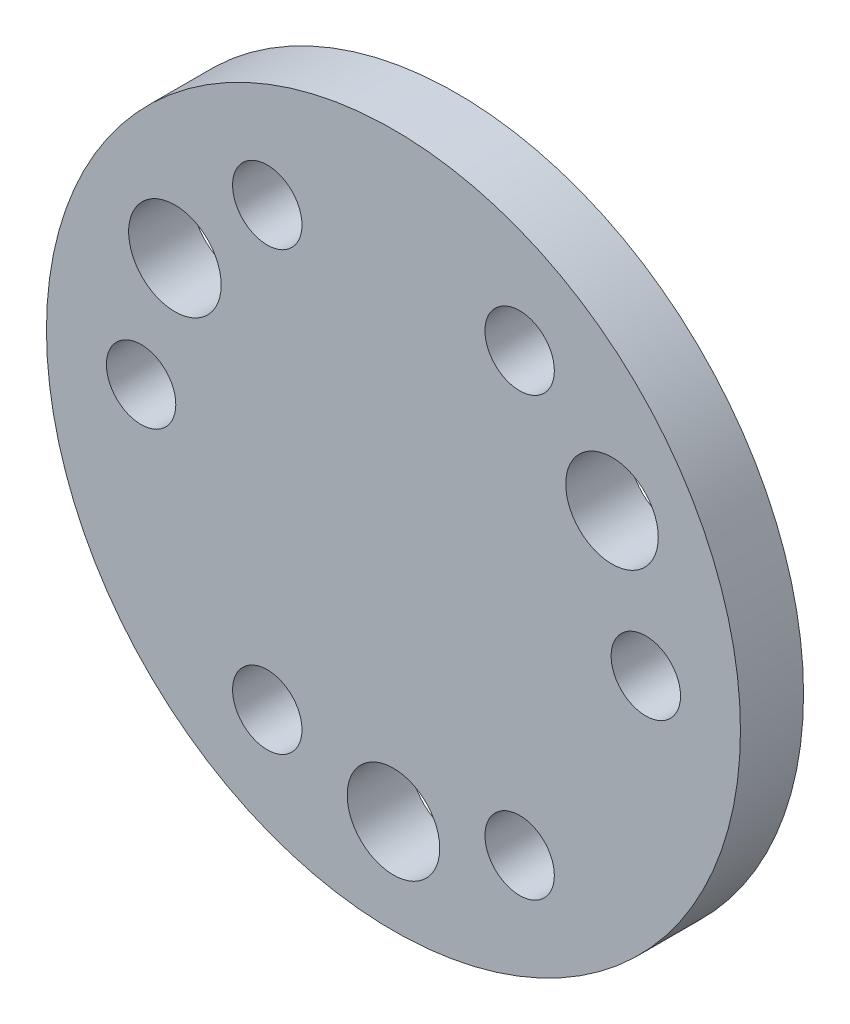
ISO-10303-21;
HEADER;
FILE_DESCRIPTION(('STEP AP214'),'2;1');
FILE_NAME('part.step','',(''),(''),'','','');
FILE_SCHEMA(('AUTOMOTIVE_DESIGN { 1 0 10303 214 1 1 1 1 }'));
ENDSEC;
DATA;
#1=APPLICATION_CONTEXT('core data for automotive mechanical design processes');
#2=APPLICATION_PROTOCOL_DEFINITION('international standard','automotive_design',2000,#1);
#3=PRODUCT_CONTEXT('',#1,'mechanical');
#4=PRODUCT('Part','Part','',(#3));
#5=PRODUCT_RELATED_PRODUCT_CATEGORY('part','',(#4));
#6=PRODUCT_DEFINITION_FORMATION('','',#4);
#7=PRODUCT_DEFINITION_CONTEXT('part definition',#1,'design');
#8=PRODUCT_DEFINITION('design','',#6,#7);
#9=PRODUCT_DEFINITION_SHAPE('','',#8);
#10=(LENGTH_UNIT() NAMED_UNIT(*) SI_UNIT(.MILLI.,.METRE.));
#11=(NAMED_UNIT(*) PLANE_ANGLE_UNIT() SI_UNIT($,.RADIAN.));
#12=(NAMED_UNIT(*) SI_UNIT($,.STERADIAN.) SOLID_ANGLE_UNIT());
#13=UNCERTAINTY_MEASURE_WITH_UNIT(LENGTH_MEASURE(1.E-05),#10,'distance_accuracy_value','');
#14=(GEOMETRIC_REPRESENTATION_CONTEXT(3) GLOBAL_UNCERTAINTY_ASSIGNED_CONTEXT((#13)) GLOBAL_UNIT_ASSIGNED_CONTEXT((#10,
#11,#12)) REPRESENTATION_CONTEXT('',''));
#15=CARTESIAN_POINT('',(0.,0.,0.));
#16=DIRECTION('',(0.,0.,1.));
#17=DIRECTION('',(1.,0.,0.));
#18=AXIS2_PLACEMENT_3D('',#15,#16,#17);
#19=CARTESIAN_POINT('',(0.,0.,3.));
#20=DIRECTION('',(0.,0.,1.));
#21=DIRECTION('',(1.,0.,0.));
#22=AXIS2_PLACEMENT_3D('',#19,#20,#21);
#23=PLANE('',#22);
#24=CARTESIAN_POINT('',(-5.99999999999703,-10.3923048454114,3.));
#25=DIRECTION('',(0.,0.,1.));
#26=DIRECTION('',(1.,0.,0.));
#27=AXIS2_PLACEMENT_3D('',#24,#25,#26);
#28=CIRCLE('',#27,1.64999999999803);
#29=CARTESIAN_POINT('',(-4.34999999999899,-10.3923048454114,3.));
#30=VERTEX_POINT('',#29);
#31=EDGE_CURVE('E113',#30,#30,#28,.T.);
#32=ORIENTED_EDGE('',*,*,#31,.F.);
#33=EDGE_LOOP('',(#32));
#34=FACE_BOUND('',#33,.T.);
#35=CARTESIAN_POINT('',(5.99999999999987,10.3923048454135,3.));
#36=DIRECTION('',(0.,0.,1.));
#37=DIRECTION('',(1.,0.,0.));
#38=AXIS2_PLACEMENT_3D('',#35,#36,#37);
#39=CIRCLE('',#38,1.64999999999995);
#40=CARTESIAN_POINT('',(7.64999999999982,10.3923048454135,3.));
#41=VERTEX_POINT('',#40);
#42=EDGE_CURVE('E97',#41,#41,#39,.T.);
#43=ORIENTED_EDGE('',*,*,#42,.F.);
#44=EDGE_LOOP('',(#43));
#45=FACE_BOUND('',#44,.T.);
#46=CARTESIAN_POINT('',(10.3923048454115,5.99999999999744,3.));
#47=DIRECTION('',(0.,0.,1.));
#48=DIRECTION('',(1.,0.,0.));
#49=AXIS2_PLACEMENT_3D('',#46,#47,#48);
#50=CIRCLE('',#49,2.20000000000026);
#51=CARTESIAN_POINT('',(12.5923048454118,5.99999999999744,3.));
#52=VERTEX_POINT('',#51);
#53=EDGE_CURVE('E81',#52,#52,#50,.T.);
#54=ORIENTED_EDGE('',*,*,#53,.F.);
#55=EDGE_LOOP('',(#54));
#56=FACE_BOUND('',#55,.T.);
#57=CARTESIAN_POINT('',(-6.00000000000001,10.39230484541,3.));
#58=DIRECTION('',(0.,0.,1.));
#59=DIRECTION('',(1.,0.,0.));
#60=AXIS2_PLACEMENT_3D('',#57,#58,#59);
#61=CIRCLE('',#60,1.64999999999799);
#62=CARTESIAN_POINT('',(-4.35000000000203,10.39230484541,3.));
#63=VERTEX_POINT('',#62);
#64=EDGE_CURVE('E65',#63,#63,#61,.T.);
#65=ORIENTED_EDGE('',*,*,#64,.F.);
#66=EDGE_LOOP('',(#65));
#67=FACE_BOUND('',#66,.T.);
#68=CARTESIAN_POINT('',(0.,0.,3.));
#69=DIRECTION('',(0.,0.,1.));
#70=DIRECTION('',(1.,0.,0.));
#71=AXIS2_PLACEMENT_3D('',#68,#69,#70);
#72=CIRCLE('',#71,16.5);
#73=CARTESIAN_POINT('',(16.5,0.,3.));
#74=VERTEX_POINT('',#73);
#75=EDGE_CURVE('E10',#74,#74,#72,.T.);
#76=ORIENTED_EDGE('',*,*,#75,.T.);
#77=EDGE_LOOP('',(#76));
#78=FACE_BOUND('',#77,.T.);
#79=CARTESIAN_POINT('',(-10.39230484541,6.00000000000001,3.));
#80=DIRECTION('',(0.,0.,1.));
#81=DIRECTION('',(1.,0.,0.));
#82=AXIS2_PLACEMENT_3D('',#79,#80,#81);
#83=CIRCLE('',#82,2.2);
#84=CARTESIAN_POINT('',(-8.19230484541001,6.00000000000001,3.));
#85=VERTEX_POINT('',#84);
#86=EDGE_CURVE('E59',#85,#85,#83,.T.);
#87=ORIENTED_EDGE('',*,*,#86,.F.);
#88=EDGE_LOOP('',(#87));
#89=FACE_BOUND('',#88,.T.);
#90=CARTESIAN_POINT('',(-12.,0.,3.));
#91=DIRECTION('',(0.,0.,1.));
#92=DIRECTION('',(1.,0.,0.));
#93=AXIS2_PLACEMENT_3D('',#90,#91,#92);
#94=CIRCLE('',#93,1.64999999999972);
#95=CARTESIAN_POINT('',(-10.3500000000003,0.,3.));
#96=VERTEX_POINT('',#95);
#97=EDGE_CURVE('E73',#96,#96,#94,.T.);
#98=ORIENTED_EDGE('',*,*,#97,.F.);
#99=EDGE_LOOP('',(#98));
#100=FACE_BOUND('',#99,.T.);
#101=CARTESIAN_POINT('',(11.999999999997,1.89623865412681E-12,3.));
#102=DIRECTION('',(0.,0.,1.));
#103=DIRECTION('',(1.,0.,0.));
#104=AXIS2_PLACEMENT_3D('',#101,#102,#103);
#105=CIRCLE('',#104,1.64999999999826);
#106=CARTESIAN_POINT('',(13.6499999999953,1.89623865412681E-12,3.));
#107=VERTEX_POINT('',#106);
#108=EDGE_CURVE('E89',#107,#107,#105,.T.);
#109=ORIENTED_EDGE('',*,*,#108,.F.);
#110=EDGE_LOOP('',(#109));
#111=FACE_BOUND('',#110,.T.);
#112=CARTESIAN_POINT('',(-1.48358097951961E-12,-11.9999999999969,3.));
#113=DIRECTION('',(0.,0.,1.));
#114=DIRECTION('',(1.,0.,0.));
#115=AXIS2_PLACEMENT_3D('',#112,#113,#114);
#116=CIRCLE('',#115,2.20000000000002);
#117=CARTESIAN_POINT('',(2.19999999999853,-11.9999999999969,3.));
#118=VERTEX_POINT('',#117);
#119=EDGE_CURVE('E105',#118,#118,#116,.T.);
#120=ORIENTED_EDGE('',*,*,#119,.F.);
#121=EDGE_LOOP('',(#120));
#122=FACE_BOUND('',#121,.T.);
#123=CARTESIAN_POINT('',(6.00000000000015,-10.392304845413,3.));
#124=DIRECTION('',(0.,0.,1.));
#125=DIRECTION('',(1.,0.,0.));
#126=AXIS2_PLACEMENT_3D('',#123,#124,#125);
#127=CIRCLE('',#126,1.64999999999969);
#128=CARTESIAN_POINT('',(7.64999999999983,-10.392304845413,3.));
#129=VERTEX_POINT('',#128);
#130=EDGE_CURVE('E121',#129,#129,#127,.T.);
#131=ORIENTED_EDGE('',*,*,#130,.F.);
#132=EDGE_LOOP('',(#131));
#133=FACE_BOUND('',#132,.T.);
#134=ADVANCED_FACE('F45',(#34,#45,#56,#67,#78,#89,#100,#111,#122,#133),#23,.T.);
#135=CARTESIAN_POINT('',(0.,0.,0.));
#136=DIRECTION('',(0.,0.,1.));
#137=DIRECTION('',(1.,0.,0.));
#138=AXIS2_PLACEMENT_3D('',#135,#136,#137);
#139=PLANE('',#138);
#140=CARTESIAN_POINT('',(0.,0.,0.));
#141=DIRECTION('',(0.,0.,1.));
#142=DIRECTION('',(1.,0.,0.));
#143=AXIS2_PLACEMENT_3D('',#140,#141,#142);
#144=CIRCLE('',#143,16.5);
#145=CARTESIAN_POINT('',(16.5,0.,0.));
#146=VERTEX_POINT('',#145);
#147=EDGE_CURVE('E49',#146,#146,#144,.T.);
#148=ORIENTED_EDGE('',*,*,#147,.F.);
#149=EDGE_LOOP('',(#148));
#150=FACE_BOUND('',#149,.T.);
#151=CARTESIAN_POINT('',(-10.39230484541,6.00000000000001,0.));
#152=DIRECTION('',(0.,0.,1.));
#153=DIRECTION('',(1.,0.,0.));
#154=AXIS2_PLACEMENT_3D('',#151,#152,#153);
#155=CIRCLE('',#154,2.2);
#156=CARTESIAN_POINT('',(-8.19230484541001,6.00000000000001,0.));
#157=VERTEX_POINT('',#156);
#158=EDGE_CURVE('E61',#157,#157,#155,.T.);
#159=ORIENTED_EDGE('',*,*,#158,.T.);
#160=EDGE_LOOP('',(#159));
#161=FACE_BOUND('',#160,.T.);
#162=CARTESIAN_POINT('',(-6.00000000000001,10.39230484541,0.));
#163=DIRECTION('',(0.,0.,1.));
#164=DIRECTION('',(1.,0.,0.));
#165=AXIS2_PLACEMENT_3D('',#162,#163,#164);
#166=CIRCLE('',#165,1.64999999999799);
#167=CARTESIAN_POINT('',(-4.35000000000203,10.39230484541,0.));
#168=VERTEX_POINT('',#167);
#169=EDGE_CURVE('E69',#168,#168,#166,.T.);
#170=ORIENTED_EDGE('',*,*,#169,.T.);
#171=EDGE_LOOP('',(#170));
#172=FACE_BOUND('',#171,.T.);
#173=CARTESIAN_POINT('',(-12.,0.,0.));
#174=DIRECTION('',(0.,0.,1.));
#175=DIRECTION('',(1.,0.,0.));
#176=AXIS2_PLACEMENT_3D('',#173,#174,#175);
#177=CIRCLE('',#176,1.64999999999972);
#178=CARTESIAN_POINT('',(-10.3500000000003,0.,0.));
#179=VERTEX_POINT('',#178);
#180=EDGE_CURVE('E77',#179,#179,#177,.T.);
#181=ORIENTED_EDGE('',*,*,#180,.T.);
#182=EDGE_LOOP('',(#181));
#183=FACE_BOUND('',#182,.T.);
#184=CARTESIAN_POINT('',(10.3923048454115,5.99999999999744,0.));
#185=DIRECTION('',(0.,0.,1.));
#186=DIRECTION('',(1.,0.,0.));
#187=AXIS2_PLACEMENT_3D('',#184,#185,#186);
#188=CIRCLE('',#187,2.20000000000026);
#189=CARTESIAN_POINT('',(12.5923048454118,5.99999999999744,0.));
#190=VERTEX_POINT('',#189);
#191=EDGE_CURVE('E85',#190,#190,#188,.T.);
#192=ORIENTED_EDGE('',*,*,#191,.T.);
#193=EDGE_LOOP('',(#192));
#194=FACE_BOUND('',#193,.T.);
#195=CARTESIAN_POINT('',(11.999999999997,1.89623865412681E-12,0.));
#196=DIRECTION('',(0.,0.,1.));
#197=DIRECTION('',(1.,0.,0.));
#198=AXIS2_PLACEMENT_3D('',#195,#196,#197);
#199=CIRCLE('',#198,1.64999999999826);
#200=CARTESIAN_POINT('',(13.6499999999953,1.89623865412681E-12,0.));
#201=VERTEX_POINT('',#200);
#202=EDGE_CURVE('E93',#201,#201,#199,.T.);
#203=ORIENTED_EDGE('',*,*,#202,.T.);
#204=EDGE_LOOP('',(#203));
#205=FACE_BOUND('',#204,.T.);
#206=CARTESIAN_POINT('',(5.99999999999987,10.3923048454135,0.));
#207=DIRECTION('',(0.,0.,1.));
#208=DIRECTION('',(1.,0.,0.));
#209=AXIS2_PLACEMENT_3D('',#206,#207,#208);
#210=CIRCLE('',#209,1.64999999999995);
#211=CARTESIAN_POINT('',(7.64999999999982,10.3923048454135,0.));
#212=VERTEX_POINT('',#211);
#213=EDGE_CURVE('E101',#212,#212,#210,.T.);
#214=ORIENTED_EDGE('',*,*,#213,.T.);
#215=EDGE_LOOP('',(#214));
#216=FACE_BOUND('',#215,.T.);
#217=CARTESIAN_POINT('',(-1.48358097951961E-12,-11.9999999999969,0.));
#218=DIRECTION('',(0.,0.,1.));
#219=DIRECTION('',(1.,0.,0.));
#220=AXIS2_PLACEMENT_3D('',#217,#218,#219);
#221=CIRCLE('',#220,2.20000000000002);
#222=CARTESIAN_POINT('',(2.19999999999853,-11.9999999999969,0.));
#223=VERTEX_POINT('',#222);
#224=EDGE_CURVE('E109',#223,#223,#221,.T.);
#225=ORIENTED_EDGE('',*,*,#224,.T.);
#226=EDGE_LOOP('',(#225));
#227=FACE_BOUND('',#226,.T.);
#228=CARTESIAN_POINT('',(-5.99999999999703,-10.3923048454114,0.));
#229=DIRECTION('',(0.,0.,1.));
#230=DIRECTION('',(1.,0.,0.));
#231=AXIS2_PLACEMENT_3D('',#228,#229,#230);
#232=CIRCLE('',#231,1.64999999999803);
#233=CARTESIAN_POINT('',(-4.34999999999899,-10.3923048454114,0.));
#234=VERTEX_POINT('',#233);
#235=EDGE_CURVE('E117',#234,#234,#232,.T.);
#236=ORIENTED_EDGE('',*,*,#235,.T.);
#237=EDGE_LOOP('',(#236));
#238=FACE_BOUND('',#237,.T.);
#239=CARTESIAN_POINT('',(6.00000000000015,-10.392304845413,0.));
#240=DIRECTION('',(0.,0.,1.));
#241=DIRECTION('',(1.,0.,0.));
#242=AXIS2_PLACEMENT_3D('',#239,#240,#241);
#243=CIRCLE('',#242,1.64999999999969);
#244=CARTESIAN_POINT('',(7.64999999999983,-10.392304845413,0.));
#245=VERTEX_POINT('',#244);
#246=EDGE_CURVE('E125',#245,#245,#243,.T.);
#247=ORIENTED_EDGE('',*,*,#246,.T.);
#248=EDGE_LOOP('',(#247));
#249=FACE_BOUND('',#248,.T.);
#250=ADVANCED_FACE('F138',(#150,#161,#172,#183,#194,#205,#216,#227,#238,#249),#139,.F.);
#251=CARTESIAN_POINT('',(0.,0.,3.));
#252=DIRECTION('',(0.,0.,-1.));
#253=DIRECTION('',(-1.,0.,0.));
#254=AXIS2_PLACEMENT_3D('',#251,#252,#253);
#255=CYLINDRICAL_SURFACE('',#254,16.5);
#256=ORIENTED_EDGE('',*,*,#75,.F.);
#257=EDGE_LOOP('',(#256));
#258=FACE_BOUND('',#257,.T.);
#259=ORIENTED_EDGE('',*,*,#147,.T.);
#260=EDGE_LOOP('',(#259));
#261=FACE_BOUND('',#260,.T.);
#262=ADVANCED_FACE('F47',(#258,#261),#255,.T.);
#263=CARTESIAN_POINT('',(-10.39230484541,6.00000000000001,3.));
#264=DIRECTION('',(0.,0.,-1.));
#265=DIRECTION('',(-1.,0.,0.));
#266=AXIS2_PLACEMENT_3D('',#263,#264,#265);
#267=CYLINDRICAL_SURFACE('',#266,2.2);
#268=ORIENTED_EDGE('',*,*,#86,.T.);
#269=EDGE_LOOP('',(#268));
#270=FACE_BOUND('',#269,.T.);
#271=ORIENTED_EDGE('',*,*,#158,.F.);
#272=EDGE_LOOP('',(#271));
#273=FACE_BOUND('',#272,.T.);
#274=ADVANCED_FACE('F148',(#270,#273),#267,.F.);
#275=CARTESIAN_POINT('',(-6.00000000000001,10.39230484541,3.));
#276=DIRECTION('',(0.,0.,-1.));
#277=DIRECTION('',(-1.,0.,0.));
#278=AXIS2_PLACEMENT_3D('',#275,#276,#277);
#279=CYLINDRICAL_SURFACE('',#278,1.64999999999799);
#280=ORIENTED_EDGE('',*,*,#64,.T.);
#281=EDGE_LOOP('',(#280));
#282=FACE_BOUND('',#281,.T.);
#283=ORIENTED_EDGE('',*,*,#169,.F.);
#284=EDGE_LOOP('',(#283));
#285=FACE_BOUND('',#284,.T.);
#286=ADVANCED_FACE('F151',(#282,#285),#279,.F.);
#287=CARTESIAN_POINT('',(-12.,0.,3.));
#288=DIRECTION('',(0.,0.,-1.));
#289=DIRECTION('',(-1.,0.,0.));
#290=AXIS2_PLACEMENT_3D('',#287,#288,#289);
#291=CYLINDRICAL_SURFACE('',#290,1.64999999999972);
#292=ORIENTED_EDGE('',*,*,#97,.T.);
#293=EDGE_LOOP('',(#292));
#294=FACE_BOUND('',#293,.T.);
#295=ORIENTED_EDGE('',*,*,#180,.F.);
#296=EDGE_LOOP('',(#295));
#297=FACE_BOUND('',#296,.T.);
#298=ADVANCED_FACE('F155',(#294,#297),#291,.F.);
#299=CARTESIAN_POINT('',(10.3923048454115,5.99999999999744,3.));
#300=DIRECTION('',(0.,0.,-1.));
#301=DIRECTION('',(-1.,0.,0.));
#302=AXIS2_PLACEMENT_3D('',#299,#300,#301);
#303=CYLINDRICAL_SURFACE('',#302,2.20000000000026);
#304=ORIENTED_EDGE('',*,*,#53,.T.);
#305=EDGE_LOOP('',(#304));
#306=FACE_BOUND('',#305,.T.);
#307=ORIENTED_EDGE('',*,*,#191,.F.);
#308=EDGE_LOOP('',(#307));
#309=FACE_BOUND('',#308,.T.);
#310=ADVANCED_FACE('F159',(#306,#309),#303,.F.);
#311=CARTESIAN_POINT('',(11.999999999997,1.89623865412681E-12,3.));
#312=DIRECTION('',(0.,0.,-1.));
#313=DIRECTION('',(-1.,0.,0.));
#314=AXIS2_PLACEMENT_3D('',#311,#312,#313);
#315=CYLINDRICAL_SURFACE('',#314,1.64999999999826);
#316=ORIENTED_EDGE('',*,*,#108,.T.);
#317=EDGE_LOOP('',(#316));
#318=FACE_BOUND('',#317,.T.);
#319=ORIENTED_EDGE('',*,*,#202,.F.);
#320=EDGE_LOOP('',(#319));
#321=FACE_BOUND('',#320,.T.);
#322=ADVANCED_FACE('F163',(#318,#321),#315,.F.);
#323=CARTESIAN_POINT('',(5.99999999999987,10.3923048454135,3.));
#324=DIRECTION('',(0.,0.,-1.));
#325=DIRECTION('',(-1.,0.,0.));
#326=AXIS2_PLACEMENT_3D('',#323,#324,#325);
#327=CYLINDRICAL_SURFACE('',#326,1.64999999999995);
#328=ORIENTED_EDGE('',*,*,#42,.T.);
#329=EDGE_LOOP('',(#328));
#330=FACE_BOUND('',#329,.T.);
#331=ORIENTED_EDGE('',*,*,#213,.F.);
#332=EDGE_LOOP('',(#331));
#333=FACE_BOUND('',#332,.T.);
#334=ADVANCED_FACE('F167',(#330,#333),#327,.F.);
#335=CARTESIAN_POINT('',(-1.48358097951961E-12,-11.9999999999969,3.));
#336=DIRECTION('',(0.,0.,-1.));
#337=DIRECTION('',(-1.,0.,0.));
#338=AXIS2_PLACEMENT_3D('',#335,#336,#337);
#339=CYLINDRICAL_SURFACE('',#338,2.20000000000002);
#340=ORIENTED_EDGE('',*,*,#119,.T.);
#341=EDGE_LOOP('',(#340));
#342=FACE_BOUND('',#341,.T.);
#343=ORIENTED_EDGE('',*,*,#224,.F.);
#344=EDGE_LOOP('',(#343));
#345=FACE_BOUND('',#344,.T.);
#346=ADVANCED_FACE('F171',(#342,#345),#339,.F.);
#347=CARTESIAN_POINT('',(-5.99999999999703,-10.3923048454114,3.));
#348=DIRECTION('',(0.,0.,-1.));
#349=DIRECTION('',(-1.,0.,0.));
#350=AXIS2_PLACEMENT_3D('',#347,#348,#349);
#351=CYLINDRICAL_SURFACE('',#350,1.64999999999803);
#352=ORIENTED_EDGE('',*,*,#31,.T.);
#353=EDGE_LOOP('',(#352));
#354=FACE_BOUND('',#353,.T.);
#355=ORIENTED_EDGE('',*,*,#235,.F.);
#356=EDGE_LOOP('',(#355));
#357=FACE_BOUND('',#356,.T.);
#358=ADVANCED_FACE('F175',(#354,#357),#351,.F.);
#359=CARTESIAN_POINT('',(6.00000000000015,-10.392304845413,3.));
#360=DIRECTION('',(0.,0.,-1.));
#361=DIRECTION('',(-1.,0.,0.));
#362=AXIS2_PLACEMENT_3D('',#359,#360,#361);
#363=CYLINDRICAL_SURFACE('',#362,1.64999999999969);
#364=ORIENTED_EDGE('',*,*,#130,.T.);
#365=EDGE_LOOP('',(#364));
#366=FACE_BOUND('',#365,.T.);
#367=ORIENTED_EDGE('',*,*,#246,.F.);
#368=EDGE_LOOP('',(#367));
#369=FACE_BOUND('',#368,.T.);
#370=ADVANCED_FACE('F134',(#366,#369),#363,.F.);
#371=CLOSED_SHELL('',(#134,#250,#262,#274,#286,#298,#310,#322,#334,#346,#358,#370));
#372=MANIFOLD_SOLID_BREP('B2',#371);
#373=ADVANCED_BREP_SHAPE_REPRESENTATION('',(#18,#372),#14);
#374=SHAPE_DEFINITION_REPRESENTATION(#9,#373);
ENDSEC;
END-ISO-10303-21;
